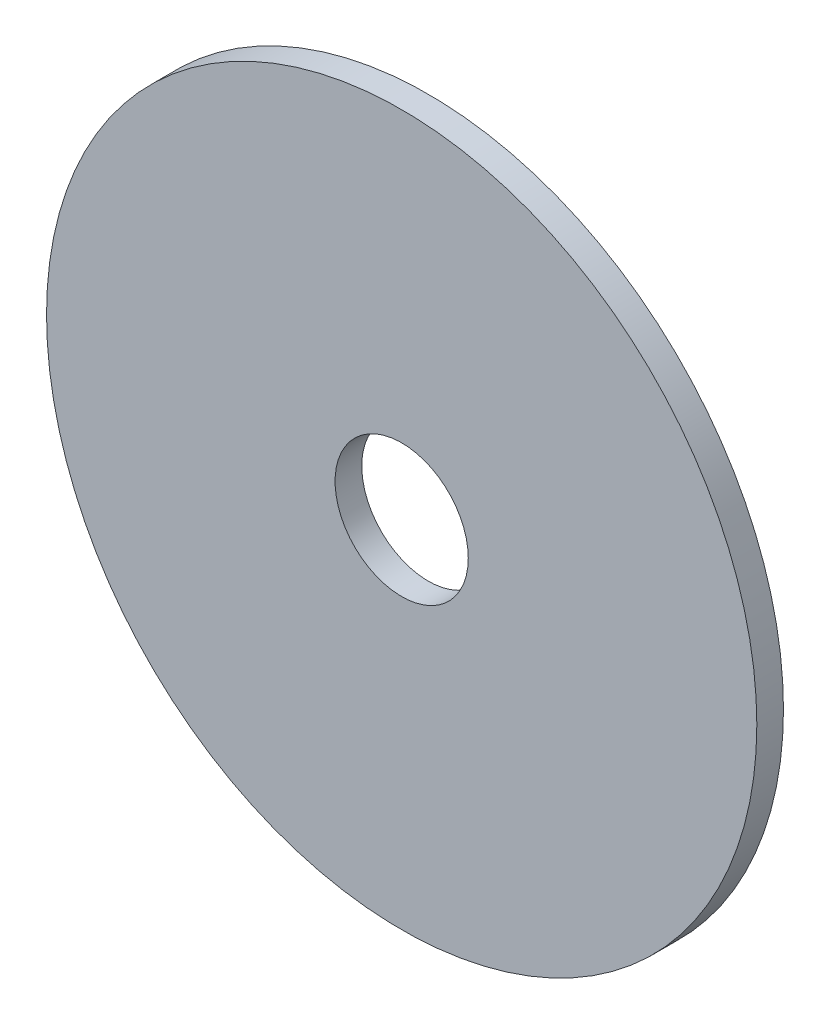
ISO-10303-21;
HEADER;
FILE_DESCRIPTION(('STEP AP214'),'2;1');
FILE_NAME('part.step','',(''),(''),'','','');
FILE_SCHEMA(('AUTOMOTIVE_DESIGN { 1 0 10303 214 1 1 1 1 }'));
ENDSEC;
DATA;
#1=APPLICATION_CONTEXT('core data for automotive mechanical design processes');
#2=APPLICATION_PROTOCOL_DEFINITION('international standard','automotive_design',2000,#1);
#3=PRODUCT_CONTEXT('',#1,'mechanical');
#4=PRODUCT('Part','Part','',(#3));
#5=PRODUCT_RELATED_PRODUCT_CATEGORY('part','',(#4));
#6=PRODUCT_DEFINITION_FORMATION('','',#4);
#7=PRODUCT_DEFINITION_CONTEXT('part definition',#1,'design');
#8=PRODUCT_DEFINITION('design','',#6,#7);
#9=PRODUCT_DEFINITION_SHAPE('','',#8);
#10=(LENGTH_UNIT() NAMED_UNIT(*) SI_UNIT(.MILLI.,.METRE.));
#11=(NAMED_UNIT(*) PLANE_ANGLE_UNIT() SI_UNIT($,.RADIAN.));
#12=(NAMED_UNIT(*) SI_UNIT($,.STERADIAN.) SOLID_ANGLE_UNIT());
#13=UNCERTAINTY_MEASURE_WITH_UNIT(LENGTH_MEASURE(1.E-05),#10,'distance_accuracy_value','');
#14=(GEOMETRIC_REPRESENTATION_CONTEXT(3) GLOBAL_UNCERTAINTY_ASSIGNED_CONTEXT((#13)) GLOBAL_UNIT_ASSIGNED_CONTEXT((#10,
#11,#12)) REPRESENTATION_CONTEXT('',''));
#15=CARTESIAN_POINT('',(0.,0.,0.));
#16=DIRECTION('',(0.,0.,1.));
#17=DIRECTION('',(1.,0.,0.));
#18=AXIS2_PLACEMENT_3D('',#15,#16,#17);
#19=CARTESIAN_POINT('',(0.,0.,0.3));
#20=DIRECTION('',(0.,0.,1.));
#21=DIRECTION('',(1.,0.,0.));
#22=AXIS2_PLACEMENT_3D('',#19,#20,#21);
#23=PLANE('',#22);
#24=CARTESIAN_POINT('',(0.,0.,0.3));
#25=DIRECTION('',(0.,0.,1.));
#26=DIRECTION('',(1.,0.,0.));
#27=AXIS2_PLACEMENT_3D('',#24,#25,#26);
#28=CIRCLE('',#27,4.);
#29=CARTESIAN_POINT('',(4.,0.,0.3));
#30=VERTEX_POINT('',#29);
#31=EDGE_CURVE('E10',#30,#30,#28,.T.);
#32=ORIENTED_EDGE('',*,*,#31,.T.);
#33=EDGE_LOOP('',(#32));
#34=FACE_BOUND('',#33,.T.);
#35=CARTESIAN_POINT('',(0.,0.,0.3));
#36=DIRECTION('',(0.,0.,1.));
#37=DIRECTION('',(1.,0.,0.));
#38=AXIS2_PLACEMENT_3D('',#35,#36,#37);
#39=CIRCLE('',#38,0.75);
#40=CARTESIAN_POINT('',(0.75,0.,0.3));
#41=VERTEX_POINT('',#40);
#42=EDGE_CURVE('E44',#41,#41,#39,.T.);
#43=ORIENTED_EDGE('',*,*,#42,.F.);
#44=EDGE_LOOP('',(#43));
#45=FACE_BOUND('',#44,.T.);
#46=ADVANCED_FACE('F33',(#34,#45),#23,.T.);
#47=CARTESIAN_POINT('',(0.,0.,0.));
#48=DIRECTION('',(0.,0.,1.));
#49=DIRECTION('',(1.,0.,0.));
#50=AXIS2_PLACEMENT_3D('',#47,#48,#49);
#51=PLANE('',#50);
#52=CARTESIAN_POINT('',(0.,0.,0.));
#53=DIRECTION('',(0.,0.,1.));
#54=DIRECTION('',(1.,0.,0.));
#55=AXIS2_PLACEMENT_3D('',#52,#53,#54);
#56=CIRCLE('',#55,4.);
#57=CARTESIAN_POINT('',(4.,0.,0.));
#58=VERTEX_POINT('',#57);
#59=EDGE_CURVE('E37',#58,#58,#56,.T.);
#60=ORIENTED_EDGE('',*,*,#59,.F.);
#61=EDGE_LOOP('',(#60));
#62=FACE_BOUND('',#61,.T.);
#63=CARTESIAN_POINT('',(0.,0.,0.));
#64=DIRECTION('',(0.,0.,1.));
#65=DIRECTION('',(1.,0.,0.));
#66=AXIS2_PLACEMENT_3D('',#63,#64,#65);
#67=CIRCLE('',#66,0.75);
#68=CARTESIAN_POINT('',(0.75,0.,0.));
#69=VERTEX_POINT('',#68);
#70=EDGE_CURVE('E46',#69,#69,#67,.T.);
#71=ORIENTED_EDGE('',*,*,#70,.T.);
#72=EDGE_LOOP('',(#71));
#73=FACE_BOUND('',#72,.T.);
#74=ADVANCED_FACE('F56',(#62,#73),#51,.F.);
#75=CARTESIAN_POINT('',(0.,0.,0.3));
#76=DIRECTION('',(0.,0.,-1.));
#77=DIRECTION('',(-1.,0.,0.));
#78=AXIS2_PLACEMENT_3D('',#75,#76,#77);
#79=CYLINDRICAL_SURFACE('',#78,4.);
#80=ORIENTED_EDGE('',*,*,#31,.F.);
#81=EDGE_LOOP('',(#80));
#82=FACE_BOUND('',#81,.T.);
#83=ORIENTED_EDGE('',*,*,#59,.T.);
#84=EDGE_LOOP('',(#83));
#85=FACE_BOUND('',#84,.T.);
#86=ADVANCED_FACE('F35',(#82,#85),#79,.T.);
#87=CARTESIAN_POINT('',(0.,0.,0.3));
#88=DIRECTION('',(0.,0.,-1.));
#89=DIRECTION('',(-1.,0.,0.));
#90=AXIS2_PLACEMENT_3D('',#87,#88,#89);
#91=CYLINDRICAL_SURFACE('',#90,0.75);
#92=ORIENTED_EDGE('',*,*,#42,.T.);
#93=EDGE_LOOP('',(#92));
#94=FACE_BOUND('',#93,.T.);
#95=ORIENTED_EDGE('',*,*,#70,.F.);
#96=EDGE_LOOP('',(#95));
#97=FACE_BOUND('',#96,.T.);
#98=ADVANCED_FACE('F52',(#94,#97),#91,.F.);
#99=CLOSED_SHELL('',(#46,#74,#86,#98));
#100=MANIFOLD_SOLID_BREP('B2',#99);
#101=ADVANCED_BREP_SHAPE_REPRESENTATION('',(#18,#100),#14);
#102=SHAPE_DEFINITION_REPRESENTATION(#9,#101);
ENDSEC;
END-ISO-10303-21;
